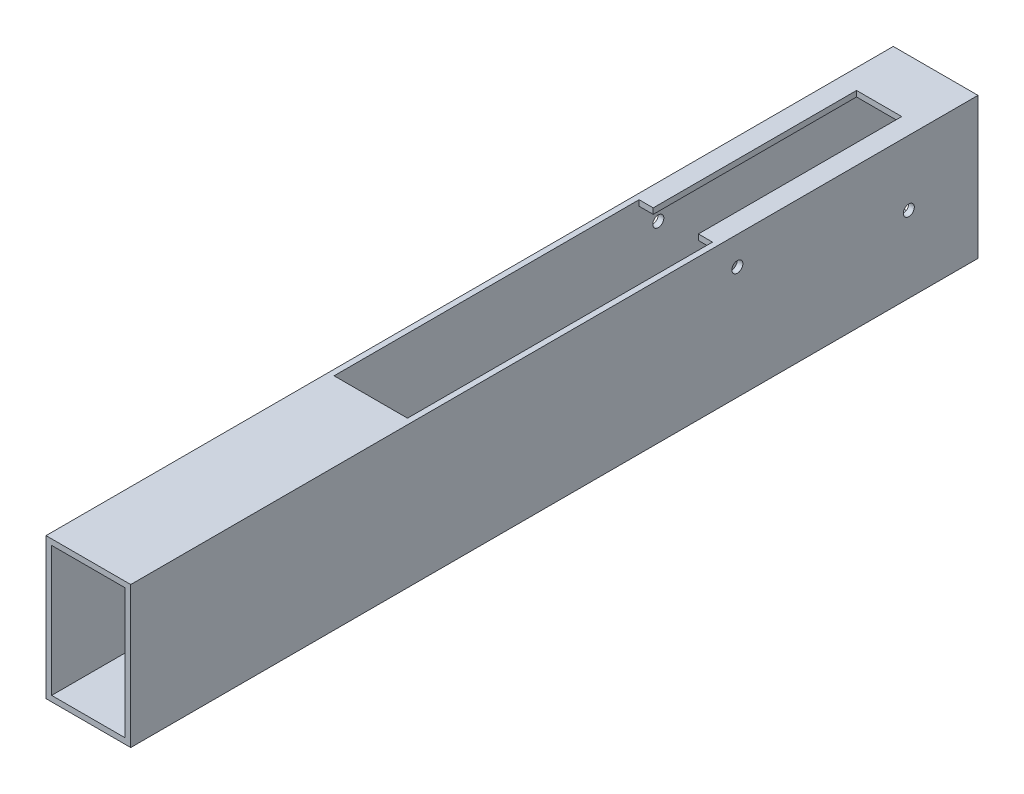
ISO-10303-21;
HEADER;
FILE_DESCRIPTION(('STEP AP214'),'2;1');
FILE_NAME('part.step','',(''),(''),'','','');
FILE_SCHEMA(('AUTOMOTIVE_DESIGN { 1 0 10303 214 1 1 1 1 }'));
ENDSEC;
DATA;
#1=APPLICATION_CONTEXT('core data for automotive mechanical design processes');
#2=APPLICATION_PROTOCOL_DEFINITION('international standard','automotive_design',2000,#1);
#3=PRODUCT_CONTEXT('',#1,'mechanical');
#4=PRODUCT('Part','Part','',(#3));
#5=PRODUCT_RELATED_PRODUCT_CATEGORY('part','',(#4));
#6=PRODUCT_DEFINITION_FORMATION('','',#4);
#7=PRODUCT_DEFINITION_CONTEXT('part definition',#1,'design');
#8=PRODUCT_DEFINITION('design','',#6,#7);
#9=PRODUCT_DEFINITION_SHAPE('','',#8);
#10=(LENGTH_UNIT() NAMED_UNIT(*) SI_UNIT(.MILLI.,.METRE.));
#11=(NAMED_UNIT(*) PLANE_ANGLE_UNIT() SI_UNIT($,.RADIAN.));
#12=(NAMED_UNIT(*) SI_UNIT($,.STERADIAN.) SOLID_ANGLE_UNIT());
#13=UNCERTAINTY_MEASURE_WITH_UNIT(LENGTH_MEASURE(1.E-05),#10,'distance_accuracy_value','');
#14=(GEOMETRIC_REPRESENTATION_CONTEXT(3) GLOBAL_UNCERTAINTY_ASSIGNED_CONTEXT((#13)) GLOBAL_UNIT_ASSIGNED_CONTEXT((#10,
#11,#12)) REPRESENTATION_CONTEXT('',''));
#15=CARTESIAN_POINT('',(0.,0.,0.));
#16=DIRECTION('',(0.,0.,1.));
#17=DIRECTION('',(1.,0.,0.));
#18=AXIS2_PLACEMENT_3D('',#15,#16,#17);
#19=CARTESIAN_POINT('',(-15.,-25.,300.));
#20=DIRECTION('',(0.,1.,0.));
#21=DIRECTION('',(0.,0.,1.));
#22=AXIS2_PLACEMENT_3D('',#19,#20,#21);
#23=PLANE('',#22);
#24=DIRECTION('',(0.,0.,-1.));
#25=VECTOR('',#24,1.);
#26=CARTESIAN_POINT('',(-5.,-25.,89.1931635393647));
#27=LINE('',#26,#25);
#28=CARTESIAN_POINT('',(-5.,-25.,89.1931635393647));
#29=VERTEX_POINT('',#28);
#30=CARTESIAN_POINT('',(-5.,-25.,78.3075239045425));
#31=VERTEX_POINT('',#30);
#32=EDGE_CURVE('E564',#29,#31,#27,.T.);
#33=ORIENTED_EDGE('',*,*,#32,.F.);
#34=DIRECTION('',(1.,0.,0.));
#35=VECTOR('',#34,1.);
#36=CARTESIAN_POINT('',(-5.,-25.,89.1931635393647));
#37=LINE('',#36,#35);
#38=CARTESIAN_POINT('',(5.,-25.,89.1931635393647));
#39=VERTEX_POINT('',#38);
#40=EDGE_CURVE('E574',#29,#39,#37,.T.);
#41=ORIENTED_EDGE('',*,*,#40,.T.);
#42=DIRECTION('',(0.,0.,-1.));
#43=VECTOR('',#42,1.);
#44=CARTESIAN_POINT('',(5.,-25.,89.1931635393647));
#45=LINE('',#44,#43);
#46=CARTESIAN_POINT('',(5.,-25.,78.3075239045425));
#47=VERTEX_POINT('',#46);
#48=EDGE_CURVE('E577',#39,#47,#45,.T.);
#49=ORIENTED_EDGE('',*,*,#48,.T.);
#50=DIRECTION('',(1.,0.,0.));
#51=VECTOR('',#50,1.);
#52=CARTESIAN_POINT('',(-5.,-25.,78.3075239045425));
#53=LINE('',#52,#51);
#54=EDGE_CURVE('E590',#31,#47,#53,.T.);
#55=ORIENTED_EDGE('',*,*,#54,.F.);
#56=EDGE_LOOP('',(#33,#41,#49,#55));
#57=FACE_BOUND('',#56,.T.);
#58=DIRECTION('',(0.,0.,-1.));
#59=VECTOR('',#58,1.);
#60=CARTESIAN_POINT('',(-13.,-25.,200.));
#61=LINE('',#60,#59);
#62=CARTESIAN_POINT('',(-13.,-25.,200.));
#63=VERTEX_POINT('',#62);
#64=CARTESIAN_POINT('',(-13.,-25.,92.));
#65=VERTEX_POINT('',#64);
#66=EDGE_CURVE('E406',#63,#65,#61,.T.);
#67=ORIENTED_EDGE('',*,*,#66,.F.);
#68=DIRECTION('',(1.,0.,0.));
#69=VECTOR('',#68,1.);
#70=CARTESIAN_POINT('',(-13.,-25.,200.));
#71=LINE('',#70,#69);
#72=CARTESIAN_POINT('',(13.,-25.,200.));
#73=VERTEX_POINT('',#72);
#74=EDGE_CURVE('E418',#63,#73,#71,.T.);
#75=ORIENTED_EDGE('',*,*,#74,.T.);
#76=DIRECTION('',(0.,0.,-1.));
#77=VECTOR('',#76,1.);
#78=CARTESIAN_POINT('',(13.,-25.,200.));
#79=LINE('',#78,#77);
#80=CARTESIAN_POINT('',(13.,-25.,92.));
#81=VERTEX_POINT('',#80);
#82=EDGE_CURVE('E412',#73,#81,#79,.T.);
#83=ORIENTED_EDGE('',*,*,#82,.T.);
#84=DIRECTION('',(1.,0.,0.));
#85=VECTOR('',#84,1.);
#86=CARTESIAN_POINT('',(-13.,-25.,92.));
#87=LINE('',#86,#85);
#88=EDGE_CURVE('E415',#65,#81,#87,.T.);
#89=ORIENTED_EDGE('',*,*,#88,.F.);
#90=EDGE_LOOP('',(#67,#75,#83,#89));
#91=FACE_BOUND('',#90,.T.);
#92=DIRECTION('',(0.,0.,-1.));
#93=VECTOR('',#92,1.);
#94=CARTESIAN_POINT('',(-5.,-25.,65.4759650683432));
#95=LINE('',#94,#93);
#96=CARTESIAN_POINT('',(-5.,-25.,65.4759650683432));
#97=VERTEX_POINT('',#96);
#98=CARTESIAN_POINT('',(-5.,-25.,40.4759650683432));
#99=VERTEX_POINT('',#98);
#100=EDGE_CURVE('E597',#97,#99,#95,.T.);
#101=ORIENTED_EDGE('',*,*,#100,.F.);
#102=DIRECTION('',(1.,0.,0.));
#103=VECTOR('',#102,1.);
#104=CARTESIAN_POINT('',(-5.,-25.,65.4759650683432));
#105=LINE('',#104,#103);
#106=CARTESIAN_POINT('',(5.,-25.,65.4759650683432));
#107=VERTEX_POINT('',#106);
#108=EDGE_CURVE('E478',#97,#107,#105,.T.);
#109=ORIENTED_EDGE('',*,*,#108,.T.);
#110=DIRECTION('',(0.,0.,-1.));
#111=VECTOR('',#110,1.);
#112=CARTESIAN_POINT('',(5.,-25.,65.4759650683432));
#113=LINE('',#112,#111);
#114=CARTESIAN_POINT('',(5.,-25.,40.4759650683432));
#115=VERTEX_POINT('',#114);
#116=EDGE_CURVE('E609',#107,#115,#113,.T.);
#117=ORIENTED_EDGE('',*,*,#116,.T.);
#118=DIRECTION('',(1.,0.,0.));
#119=VECTOR('',#118,1.);
#120=CARTESIAN_POINT('',(-5.,-25.,40.4759650683432));
#121=LINE('',#120,#119);
#122=EDGE_CURVE('E617',#99,#115,#121,.T.);
#123=ORIENTED_EDGE('',*,*,#122,.F.);
#124=EDGE_LOOP('',(#101,#109,#117,#123));
#125=FACE_BOUND('',#124,.T.);
#126=DIRECTION('',(0.,0.,-1.));
#127=VECTOR('',#126,1.);
#128=CARTESIAN_POINT('',(-10.,-25.,0.));
#129=LINE('',#128,#127);
#130=CARTESIAN_POINT('',(-10.,-25.,25.));
#131=VERTEX_POINT('',#130);
#132=CARTESIAN_POINT('',(-10.,-25.,0.));
#133=VERTEX_POINT('',#132);
#134=EDGE_CURVE('E248',#131,#133,#129,.T.);
#135=ORIENTED_EDGE('',*,*,#134,.F.);
#136=DIRECTION('',(1.,0.,0.));
#137=VECTOR('',#136,1.);
#138=CARTESIAN_POINT('',(-10.,-25.,25.));
#139=LINE('',#138,#137);
#140=CARTESIAN_POINT('',(10.,-25.,25.));
#141=VERTEX_POINT('',#140);
#142=EDGE_CURVE('E552',#131,#141,#139,.T.);
#143=ORIENTED_EDGE('',*,*,#142,.T.);
#144=DIRECTION('',(0.,0.,-1.));
#145=VECTOR('',#144,1.);
#146=CARTESIAN_POINT('',(10.,-25.,0.));
#147=LINE('',#146,#145);
#148=CARTESIAN_POINT('',(10.,-25.,0.));
#149=VERTEX_POINT('',#148);
#150=EDGE_CURVE('E253',#141,#149,#147,.T.);
#151=ORIENTED_EDGE('',*,*,#150,.T.);
#152=DIRECTION('',(1.,0.,0.));
#153=VECTOR('',#152,1.);
#154=CARTESIAN_POINT('',(-15.,-25.,0.));
#155=LINE('',#154,#153);
#156=CARTESIAN_POINT('',(15.,-25.,0.));
#157=VERTEX_POINT('',#156);
#158=EDGE_CURVE('E311',#149,#157,#155,.T.);
#159=ORIENTED_EDGE('',*,*,#158,.T.);
#160=DIRECTION('',(0.,0.,-1.));
#161=VECTOR('',#160,1.);
#162=CARTESIAN_POINT('',(15.,-25.,300.));
#163=LINE('',#162,#161);
#164=CARTESIAN_POINT('',(15.,-25.,300.));
#165=VERTEX_POINT('',#164);
#166=EDGE_CURVE('E304',#165,#157,#163,.T.);
#167=ORIENTED_EDGE('',*,*,#166,.F.);
#168=DIRECTION('',(1.,0.,0.));
#169=VECTOR('',#168,1.);
#170=CARTESIAN_POINT('',(-15.,-25.,300.));
#171=LINE('',#170,#169);
#172=CARTESIAN_POINT('',(-15.,-25.,300.));
#173=VERTEX_POINT('',#172);
#174=EDGE_CURVE('E302',#173,#165,#171,.T.);
#175=ORIENTED_EDGE('',*,*,#174,.F.);
#176=DIRECTION('',(0.,0.,-1.));
#177=VECTOR('',#176,1.);
#178=CARTESIAN_POINT('',(-15.,-25.,300.));
#179=LINE('',#178,#177);
#180=CARTESIAN_POINT('',(-15.,-25.,0.));
#181=VERTEX_POINT('',#180);
#182=EDGE_CURVE('E315',#173,#181,#179,.T.);
#183=ORIENTED_EDGE('',*,*,#182,.T.);
#184=EDGE_CURVE('E298',#181,#133,#155,.T.);
#185=ORIENTED_EDGE('',*,*,#184,.T.);
#186=EDGE_LOOP('',(#135,#143,#151,#159,#167,#175,#183,#185));
#187=FACE_BOUND('',#186,.T.);
#188=ADVANCED_FACE('F32',(#57,#91,#125,#187),#23,.F.);
#189=CARTESIAN_POINT('',(-13.,-23.,300.));
#190=DIRECTION('',(0.,1.,0.));
#191=DIRECTION('',(-1.,0.,0.));
#192=AXIS2_PLACEMENT_3D('',#189,#190,#191);
#193=PLANE('',#192);
#194=DIRECTION('',(1.,0.,0.));
#195=VECTOR('',#194,1.);
#196=CARTESIAN_POINT('',(-5.,-23.,65.4759650683432));
#197=LINE('',#196,#195);
#198=CARTESIAN_POINT('',(-5.,-23.,65.4759650683432));
#199=VERTEX_POINT('',#198);
#200=CARTESIAN_POINT('',(5.,-23.,65.4759650683432));
#201=VERTEX_POINT('',#200);
#202=EDGE_CURVE('E399',#199,#201,#197,.T.);
#203=ORIENTED_EDGE('',*,*,#202,.F.);
#204=DIRECTION('',(0.,0.,1.));
#205=VECTOR('',#204,1.);
#206=CARTESIAN_POINT('',(-5.,-23.,65.4759650683432));
#207=LINE('',#206,#205);
#208=CARTESIAN_POINT('',(-5.,-23.,40.4759650683432));
#209=VERTEX_POINT('',#208);
#210=EDGE_CURVE('E604',#209,#199,#207,.T.);
#211=ORIENTED_EDGE('',*,*,#210,.F.);
#212=DIRECTION('',(1.,0.,0.));
#213=VECTOR('',#212,1.);
#214=CARTESIAN_POINT('',(-5.,-23.,40.4759650683432));
#215=LINE('',#214,#213);
#216=CARTESIAN_POINT('',(5.,-23.,40.4759650683432));
#217=VERTEX_POINT('',#216);
#218=EDGE_CURVE('E402',#209,#217,#215,.T.);
#219=ORIENTED_EDGE('',*,*,#218,.T.);
#220=DIRECTION('',(0.,0.,1.));
#221=VECTOR('',#220,1.);
#222=CARTESIAN_POINT('',(5.,-23.,65.4759650683432));
#223=LINE('',#222,#221);
#224=EDGE_CURVE('E598',#217,#201,#223,.T.);
#225=ORIENTED_EDGE('',*,*,#224,.T.);
#226=EDGE_LOOP('',(#203,#211,#219,#225));
#227=FACE_BOUND('',#226,.T.);
#228=DIRECTION('',(1.,0.,0.));
#229=VECTOR('',#228,1.);
#230=CARTESIAN_POINT('',(-5.,-23.,89.1931635393647));
#231=LINE('',#230,#229);
#232=CARTESIAN_POINT('',(-5.,-23.,89.1931635393647));
#233=VERTEX_POINT('',#232);
#234=CARTESIAN_POINT('',(5.,-23.,89.1931635393647));
#235=VERTEX_POINT('',#234);
#236=EDGE_CURVE('E583',#233,#235,#231,.T.);
#237=ORIENTED_EDGE('',*,*,#236,.F.);
#238=DIRECTION('',(0.,0.,1.));
#239=VECTOR('',#238,1.);
#240=CARTESIAN_POINT('',(-5.,-23.,89.1931635393647));
#241=LINE('',#240,#239);
#242=CARTESIAN_POINT('',(-5.,-23.,78.3075239045425));
#243=VERTEX_POINT('',#242);
#244=EDGE_CURVE('E571',#243,#233,#241,.T.);
#245=ORIENTED_EDGE('',*,*,#244,.F.);
#246=DIRECTION('',(1.,0.,0.));
#247=VECTOR('',#246,1.);
#248=CARTESIAN_POINT('',(-5.,-23.,78.3075239045425));
#249=LINE('',#248,#247);
#250=CARTESIAN_POINT('',(5.,-23.,78.3075239045425));
#251=VERTEX_POINT('',#250);
#252=EDGE_CURVE('E587',#243,#251,#249,.T.);
#253=ORIENTED_EDGE('',*,*,#252,.T.);
#254=DIRECTION('',(0.,0.,1.));
#255=VECTOR('',#254,1.);
#256=CARTESIAN_POINT('',(5.,-23.,89.1931635393647));
#257=LINE('',#256,#255);
#258=EDGE_CURVE('E565',#251,#235,#257,.T.);
#259=ORIENTED_EDGE('',*,*,#258,.T.);
#260=EDGE_LOOP('',(#237,#245,#253,#259));
#261=FACE_BOUND('',#260,.T.);
#262=DIRECTION('',(1.,0.,0.));
#263=VECTOR('',#262,1.);
#264=CARTESIAN_POINT('',(-10.,-23.,25.));
#265=LINE('',#264,#263);
#266=CARTESIAN_POINT('',(-10.,-23.,25.));
#267=VERTEX_POINT('',#266);
#268=CARTESIAN_POINT('',(10.,-23.,25.));
#269=VERTEX_POINT('',#268);
#270=EDGE_CURVE('E261',#267,#269,#265,.T.);
#271=ORIENTED_EDGE('',*,*,#270,.F.);
#272=DIRECTION('',(0.,0.,1.));
#273=VECTOR('',#272,1.);
#274=CARTESIAN_POINT('',(-10.,-23.,0.));
#275=LINE('',#274,#273);
#276=CARTESIAN_POINT('',(-10.,-23.,0.));
#277=VERTEX_POINT('',#276);
#278=EDGE_CURVE('E245',#277,#267,#275,.T.);
#279=ORIENTED_EDGE('',*,*,#278,.F.);
#280=DIRECTION('',(1.,0.,0.));
#281=VECTOR('',#280,1.);
#282=CARTESIAN_POINT('',(-13.,-23.,0.));
#283=LINE('',#282,#281);
#284=CARTESIAN_POINT('',(-13.,-23.,0.));
#285=VERTEX_POINT('',#284);
#286=EDGE_CURVE('E259',#285,#277,#283,.T.);
#287=ORIENTED_EDGE('',*,*,#286,.F.);
#288=DIRECTION('',(0.,0.,-1.));
#289=VECTOR('',#288,1.);
#290=CARTESIAN_POINT('',(-13.,-23.,300.));
#291=LINE('',#290,#289);
#292=CARTESIAN_POINT('',(-13.,-23.,92.));
#293=VERTEX_POINT('',#292);
#294=EDGE_CURVE('E285',#293,#285,#291,.T.);
#295=ORIENTED_EDGE('',*,*,#294,.F.);
#296=DIRECTION('',(-1.,0.,0.));
#297=VECTOR('',#296,1.);
#298=CARTESIAN_POINT('',(-13.,-23.,92.));
#299=LINE('',#298,#297);
#300=CARTESIAN_POINT('',(13.,-23.,92.));
#301=VERTEX_POINT('',#300);
#302=EDGE_CURVE('E378',#301,#293,#299,.T.);
#303=ORIENTED_EDGE('',*,*,#302,.F.);
#304=DIRECTION('',(0.,0.,-1.));
#305=VECTOR('',#304,1.);
#306=CARTESIAN_POINT('',(13.,-23.,300.));
#307=LINE('',#306,#305);
#308=CARTESIAN_POINT('',(13.,-23.,0.));
#309=VERTEX_POINT('',#308);
#310=EDGE_CURVE('E280',#301,#309,#307,.T.);
#311=ORIENTED_EDGE('',*,*,#310,.T.);
#312=CARTESIAN_POINT('',(9.99999999999999,-23.,0.));
#313=VERTEX_POINT('',#312);
#314=EDGE_CURVE('E269',#313,#309,#283,.T.);
#315=ORIENTED_EDGE('',*,*,#314,.F.);
#316=DIRECTION('',(0.,0.,1.));
#317=VECTOR('',#316,1.);
#318=CARTESIAN_POINT('',(10.,-23.,0.));
#319=LINE('',#318,#317);
#320=EDGE_CURVE('E47',#313,#269,#319,.T.);
#321=ORIENTED_EDGE('',*,*,#320,.T.);
#322=EDGE_LOOP('',(#271,#279,#287,#295,#303,#311,#315,#321));
#323=FACE_BOUND('',#322,.T.);
#324=ADVANCED_FACE('F257',(#227,#261,#323),#193,.T.);
#325=CARTESIAN_POINT('',(0.,0.,0.));
#326=DIRECTION('',(0.,0.,1.));
#327=DIRECTION('',(1.,0.,0.));
#328=AXIS2_PLACEMENT_3D('',#325,#326,#327);
#329=PLANE('',#328);
#330=DIRECTION('',(0.,1.,0.));
#331=VECTOR('',#330,1.);
#332=CARTESIAN_POINT('',(-10.,-25.,0.));
#333=LINE('',#332,#331);
#334=EDGE_CURVE('E241',#133,#277,#333,.T.);
#335=ORIENTED_EDGE('',*,*,#334,.F.);
#336=ORIENTED_EDGE('',*,*,#184,.F.);
#337=DIRECTION('',(0.,-1.,0.));
#338=VECTOR('',#337,1.);
#339=CARTESIAN_POINT('',(-15.,25.,0.));
#340=LINE('',#339,#338);
#341=CARTESIAN_POINT('',(-15.,25.,0.));
#342=VERTEX_POINT('',#341);
#343=EDGE_CURVE('E309',#342,#181,#340,.T.);
#344=ORIENTED_EDGE('',*,*,#343,.F.);
#345=DIRECTION('',(-1.,0.,0.));
#346=VECTOR('',#345,1.);
#347=CARTESIAN_POINT('',(-15.,25.,0.));
#348=LINE('',#347,#346);
#349=CARTESIAN_POINT('',(15.,25.,0.));
#350=VERTEX_POINT('',#349);
#351=EDGE_CURVE('E307',#350,#342,#348,.T.);
#352=ORIENTED_EDGE('',*,*,#351,.F.);
#353=DIRECTION('',(0.,1.,0.));
#354=VECTOR('',#353,1.);
#355=CARTESIAN_POINT('',(15.,25.,0.));
#356=LINE('',#355,#354);
#357=EDGE_CURVE('E293',#157,#350,#356,.T.);
#358=ORIENTED_EDGE('',*,*,#357,.F.);
#359=ORIENTED_EDGE('',*,*,#158,.F.);
#360=DIRECTION('',(0.,1.,0.));
#361=VECTOR('',#360,1.);
#362=CARTESIAN_POINT('',(10.,-25.,0.));
#363=LINE('',#362,#361);
#364=EDGE_CURVE('E909',#149,#313,#363,.T.);
#365=ORIENTED_EDGE('',*,*,#364,.T.);
#366=ORIENTED_EDGE('',*,*,#314,.T.);
#367=DIRECTION('',(0.,1.,0.));
#368=VECTOR('',#367,1.);
#369=CARTESIAN_POINT('',(13.,23.,0.));
#370=LINE('',#369,#368);
#371=CARTESIAN_POINT('',(13.,23.,0.));
#372=VERTEX_POINT('',#371);
#373=EDGE_CURVE('E268',#309,#372,#370,.T.);
#374=ORIENTED_EDGE('',*,*,#373,.T.);
#375=DIRECTION('',(-1.,0.,0.));
#376=VECTOR('',#375,1.);
#377=CARTESIAN_POINT('',(-13.,23.,0.));
#378=LINE('',#377,#376);
#379=CARTESIAN_POINT('',(-13.,23.,0.));
#380=VERTEX_POINT('',#379);
#381=EDGE_CURVE('E352',#372,#380,#378,.T.);
#382=ORIENTED_EDGE('',*,*,#381,.T.);
#383=DIRECTION('',(0.,-1.,0.));
#384=VECTOR('',#383,1.);
#385=CARTESIAN_POINT('',(-13.,23.,0.));
#386=LINE('',#385,#384);
#387=EDGE_CURVE('E267',#380,#285,#386,.T.);
#388=ORIENTED_EDGE('',*,*,#387,.T.);
#389=ORIENTED_EDGE('',*,*,#286,.T.);
#390=EDGE_LOOP('',(#335,#336,#344,#352,#358,#359,#365,#366,#374,#382,#388,#389));
#391=FACE_BOUND('',#390,.T.);
#392=ADVANCED_FACE('F264',(#391),#329,.F.);
#393=CARTESIAN_POINT('',(-13.,23.,300.));
#394=DIRECTION('',(0.,-1.,0.));
#395=DIRECTION('',(0.,0.,-1.));
#396=AXIS2_PLACEMENT_3D('',#393,#394,#395);
#397=PLANE('',#396);
#398=DIRECTION('',(-1.,0.,0.));
#399=VECTOR('',#398,1.);
#400=CARTESIAN_POINT('',(-13.,23.,200.));
#401=LINE('',#400,#399);
#402=CARTESIAN_POINT('',(13.,23.,200.));
#403=VERTEX_POINT('',#402);
#404=CARTESIAN_POINT('',(-13.,23.,200.));
#405=VERTEX_POINT('',#404);
#406=EDGE_CURVE('E433',#403,#405,#401,.T.);
#407=ORIENTED_EDGE('',*,*,#406,.F.);
#408=DIRECTION('',(0.,0.,-1.));
#409=VECTOR('',#408,1.);
#410=CARTESIAN_POINT('',(13.,23.,300.));
#411=LINE('',#410,#409);
#412=CARTESIAN_POINT('',(13.,23.,300.));
#413=VERTEX_POINT('',#412);
#414=EDGE_CURVE('E277',#413,#403,#411,.T.);
#415=ORIENTED_EDGE('',*,*,#414,.F.);
#416=DIRECTION('',(-1.,0.,0.));
#417=VECTOR('',#416,1.);
#418=CARTESIAN_POINT('',(-13.,23.,300.));
#419=LINE('',#418,#417);
#420=CARTESIAN_POINT('',(-13.,23.,300.));
#421=VERTEX_POINT('',#420);
#422=EDGE_CURVE('E272',#413,#421,#419,.T.);
#423=ORIENTED_EDGE('',*,*,#422,.T.);
#424=DIRECTION('',(0.,0.,-1.));
#425=VECTOR('',#424,1.);
#426=CARTESIAN_POINT('',(-13.,23.,300.));
#427=LINE('',#426,#425);
#428=EDGE_CURVE('E290',#421,#405,#427,.T.);
#429=ORIENTED_EDGE('',*,*,#428,.T.);
#430=EDGE_LOOP('',(#407,#415,#423,#429));
#431=FACE_BOUND('',#430,.T.);
#432=ADVANCED_FACE('F701',(#431),#397,.T.);
#433=DIRECTION('',(1.,0.,0.));
#434=VECTOR('',#433,1.);
#435=CARTESIAN_POINT('',(-13.,-23.,200.));
#436=LINE('',#435,#434);
#437=CARTESIAN_POINT('',(-13.,-23.,200.));
#438=VERTEX_POINT('',#437);
#439=CARTESIAN_POINT('',(13.,-23.,200.));
#440=VERTEX_POINT('',#439);
#441=EDGE_CURVE('E382',#438,#440,#436,.T.);
#442=ORIENTED_EDGE('',*,*,#441,.F.);
#443=CARTESIAN_POINT('',(-13.,-23.,300.));
#444=VERTEX_POINT('',#443);
#445=EDGE_CURVE('E286',#444,#438,#291,.T.);
#446=ORIENTED_EDGE('',*,*,#445,.F.);
#447=DIRECTION('',(1.,0.,0.));
#448=VECTOR('',#447,1.);
#449=CARTESIAN_POINT('',(-13.,-23.,300.));
#450=LINE('',#449,#448);
#451=CARTESIAN_POINT('',(13.,-23.,300.));
#452=VERTEX_POINT('',#451);
#453=EDGE_CURVE('E356',#444,#452,#450,.T.);
#454=ORIENTED_EDGE('',*,*,#453,.T.);
#455=EDGE_CURVE('E282',#452,#440,#307,.T.);
#456=ORIENTED_EDGE('',*,*,#455,.T.);
#457=EDGE_LOOP('',(#442,#446,#454,#456));
#458=FACE_BOUND('',#457,.T.);
#459=ADVANCED_FACE('F516',(#458),#193,.T.);
#460=CARTESIAN_POINT('',(0.,0.,300.));
#461=DIRECTION('',(0.,0.,1.));
#462=DIRECTION('',(1.,0.,0.));
#463=AXIS2_PLACEMENT_3D('',#460,#461,#462);
#464=PLANE('',#463);
#465=DIRECTION('',(0.,1.,0.));
#466=VECTOR('',#465,1.);
#467=CARTESIAN_POINT('',(15.,25.,300.));
#468=LINE('',#467,#466);
#469=CARTESIAN_POINT('',(15.,25.,300.));
#470=VERTEX_POINT('',#469);
#471=EDGE_CURVE('E294',#165,#470,#468,.T.);
#472=ORIENTED_EDGE('',*,*,#471,.T.);
#473=DIRECTION('',(-1.,0.,0.));
#474=VECTOR('',#473,1.);
#475=CARTESIAN_POINT('',(-15.,25.,300.));
#476=LINE('',#475,#474);
#477=CARTESIAN_POINT('',(-15.,25.,300.));
#478=VERTEX_POINT('',#477);
#479=EDGE_CURVE('E297',#470,#478,#476,.T.);
#480=ORIENTED_EDGE('',*,*,#479,.T.);
#481=DIRECTION('',(0.,-1.,0.));
#482=VECTOR('',#481,1.);
#483=CARTESIAN_POINT('',(-15.,25.,300.));
#484=LINE('',#483,#482);
#485=EDGE_CURVE('E300',#478,#173,#484,.T.);
#486=ORIENTED_EDGE('',*,*,#485,.T.);
#487=ORIENTED_EDGE('',*,*,#174,.T.);
#488=EDGE_LOOP('',(#472,#480,#486,#487));
#489=FACE_BOUND('',#488,.T.);
#490=DIRECTION('',(0.,-1.,0.));
#491=VECTOR('',#490,1.);
#492=CARTESIAN_POINT('',(-13.,23.,300.));
#493=LINE('',#492,#491);
#494=EDGE_CURVE('E354',#421,#444,#493,.T.);
#495=ORIENTED_EDGE('',*,*,#494,.F.);
#496=ORIENTED_EDGE('',*,*,#422,.F.);
#497=DIRECTION('',(0.,1.,0.));
#498=VECTOR('',#497,1.);
#499=CARTESIAN_POINT('',(13.,23.,300.));
#500=LINE('',#499,#498);
#501=EDGE_CURVE('E359',#452,#413,#500,.T.);
#502=ORIENTED_EDGE('',*,*,#501,.F.);
#503=ORIENTED_EDGE('',*,*,#453,.F.);
#504=EDGE_LOOP('',(#495,#496,#502,#503));
#505=FACE_BOUND('',#504,.T.);
#506=ADVANCED_FACE('F527',(#489,#505),#464,.T.);
#507=CARTESIAN_POINT('',(15.,25.,300.));
#508=DIRECTION('',(-1.,0.,0.));
#509=DIRECTION('',(0.,-1.,0.));
#510=AXIS2_PLACEMENT_3D('',#507,#508,#509);
#511=PLANE('',#510);
#512=CARTESIAN_POINT('',(15.,2.,24.5));
#513=DIRECTION('',(1.,0.,0.));
#514=DIRECTION('',(0.,0.,-1.));
#515=AXIS2_PLACEMENT_3D('',#512,#513,#514);
#516=CIRCLE('',#515,1.95);
#517=CARTESIAN_POINT('',(15.,2.,22.55));
#518=VERTEX_POINT('',#517);
#519=EDGE_CURVE('E337',#518,#518,#516,.T.);
#520=ORIENTED_EDGE('',*,*,#519,.F.);
#521=EDGE_LOOP('',(#520));
#522=FACE_BOUND('',#521,.T.);
#523=CARTESIAN_POINT('',(15.,15.,85.2));
#524=DIRECTION('',(1.,0.,0.));
#525=DIRECTION('',(0.,0.,-1.));
#526=AXIS2_PLACEMENT_3D('',#523,#524,#525);
#527=CIRCLE('',#526,1.95);
#528=CARTESIAN_POINT('',(15.,15.,83.25));
#529=VERTEX_POINT('',#528);
#530=EDGE_CURVE('E334',#529,#529,#527,.T.);
#531=ORIENTED_EDGE('',*,*,#530,.F.);
#532=EDGE_LOOP('',(#531));
#533=FACE_BOUND('',#532,.T.);
#534=ORIENTED_EDGE('',*,*,#357,.T.);
#535=DIRECTION('',(0.,0.,-1.));
#536=VECTOR('',#535,1.);
#537=CARTESIAN_POINT('',(15.,25.,300.));
#538=LINE('',#537,#536);
#539=EDGE_CURVE('E40',#470,#350,#538,.T.);
#540=ORIENTED_EDGE('',*,*,#539,.F.);
#541=ORIENTED_EDGE('',*,*,#471,.F.);
#542=ORIENTED_EDGE('',*,*,#166,.T.);
#543=EDGE_LOOP('',(#534,#540,#541,#542));
#544=FACE_BOUND('',#543,.T.);
#545=ADVANCED_FACE('F34',(#522,#533,#544),#511,.F.);
#546=CARTESIAN_POINT('',(-15.,25.,300.));
#547=DIRECTION('',(0.,-1.,0.));
#548=DIRECTION('',(0.,0.,-1.));
#549=AXIS2_PLACEMENT_3D('',#546,#547,#548);
#550=PLANE('',#549);
#551=DIRECTION('',(0.,0.,1.));
#552=VECTOR('',#551,1.);
#553=CARTESIAN_POINT('',(-13.,25.,92.));
#554=LINE('',#553,#552);
#555=CARTESIAN_POINT('',(-13.,25.,92.));
#556=VERTEX_POINT('',#555);
#557=CARTESIAN_POINT('',(-13.,25.,200.));
#558=VERTEX_POINT('',#557);
#559=EDGE_CURVE('E475',#556,#558,#554,.T.);
#560=ORIENTED_EDGE('',*,*,#559,.F.);
#561=DIRECTION('',(1.,0.,0.));
#562=VECTOR('',#561,1.);
#563=CARTESIAN_POINT('',(-13.,25.,92.));
#564=LINE('',#563,#562);
#565=CARTESIAN_POINT('',(-8.,25.,92.));
#566=VERTEX_POINT('',#565);
#567=EDGE_CURVE('E423',#556,#566,#564,.T.);
#568=ORIENTED_EDGE('',*,*,#567,.T.);
#569=DIRECTION('',(0.,0.,1.));
#570=VECTOR('',#569,1.);
#571=CARTESIAN_POINT('',(-8.,25.,97.25));
#572=LINE('',#571,#570);
#573=CARTESIAN_POINT('',(-8.,25.,20.));
#574=VERTEX_POINT('',#573);
#575=EDGE_CURVE('E436',#574,#566,#572,.T.);
#576=ORIENTED_EDGE('',*,*,#575,.F.);
#577=DIRECTION('',(1.,0.,0.));
#578=VECTOR('',#577,1.);
#579=CARTESIAN_POINT('',(-8.,25.,20.));
#580=LINE('',#579,#578);
#581=CARTESIAN_POINT('',(8.,25.,20.));
#582=VERTEX_POINT('',#581);
#583=EDGE_CURVE('E442',#574,#582,#580,.T.);
#584=ORIENTED_EDGE('',*,*,#583,.T.);
#585=DIRECTION('',(0.,0.,1.));
#586=VECTOR('',#585,1.);
#587=CARTESIAN_POINT('',(8.,25.,97.25));
#588=LINE('',#587,#586);
#589=CARTESIAN_POINT('',(8.,25.,92.));
#590=VERTEX_POINT('',#589);
#591=EDGE_CURVE('E435',#582,#590,#588,.T.);
#592=ORIENTED_EDGE('',*,*,#591,.T.);
#593=CARTESIAN_POINT('',(13.,25.,92.));
#594=VERTEX_POINT('',#593);
#595=EDGE_CURVE('E426',#590,#594,#564,.T.);
#596=ORIENTED_EDGE('',*,*,#595,.T.);
#597=DIRECTION('',(0.,0.,1.));
#598=VECTOR('',#597,1.);
#599=CARTESIAN_POINT('',(13.,25.,92.));
#600=LINE('',#599,#598);
#601=CARTESIAN_POINT('',(13.,25.,200.));
#602=VERTEX_POINT('',#601);
#603=EDGE_CURVE('E396',#594,#602,#600,.T.);
#604=ORIENTED_EDGE('',*,*,#603,.T.);
#605=DIRECTION('',(1.,0.,0.));
#606=VECTOR('',#605,1.);
#607=CARTESIAN_POINT('',(-13.,25.,200.));
#608=LINE('',#607,#606);
#609=EDGE_CURVE('E421',#558,#602,#608,.T.);
#610=ORIENTED_EDGE('',*,*,#609,.F.);
#611=EDGE_LOOP('',(#560,#568,#576,#584,#592,#596,#604,#610));
#612=FACE_BOUND('',#611,.T.);
#613=ORIENTED_EDGE('',*,*,#351,.T.);
#614=DIRECTION('',(0.,0.,-1.));
#615=VECTOR('',#614,1.);
#616=CARTESIAN_POINT('',(-15.,25.,300.));
#617=LINE('',#616,#615);
#618=EDGE_CURVE('E318',#478,#342,#617,.T.);
#619=ORIENTED_EDGE('',*,*,#618,.F.);
#620=ORIENTED_EDGE('',*,*,#479,.F.);
#621=ORIENTED_EDGE('',*,*,#539,.T.);
#622=EDGE_LOOP('',(#613,#619,#620,#621));
#623=FACE_BOUND('',#622,.T.);
#624=ADVANCED_FACE('F466',(#612,#623),#550,.F.);
#625=CARTESIAN_POINT('',(-15.,25.,300.));
#626=DIRECTION('',(1.,0.,0.));
#627=DIRECTION('',(0.,1.,0.));
#628=AXIS2_PLACEMENT_3D('',#625,#626,#627);
#629=PLANE('',#628);
#630=CARTESIAN_POINT('',(-15.,2.,24.5));
#631=DIRECTION('',(1.,0.,0.));
#632=DIRECTION('',(0.,0.,-1.));
#633=AXIS2_PLACEMENT_3D('',#630,#631,#632);
#634=CIRCLE('',#633,1.95);
#635=CARTESIAN_POINT('',(-15.,2.,22.55));
#636=VERTEX_POINT('',#635);
#637=EDGE_CURVE('E330',#636,#636,#634,.T.);
#638=ORIENTED_EDGE('',*,*,#637,.T.);
#639=EDGE_LOOP('',(#638));
#640=FACE_BOUND('',#639,.T.);
#641=CARTESIAN_POINT('',(-15.,15.,85.2));
#642=DIRECTION('',(1.,0.,0.));
#643=DIRECTION('',(0.,0.,-1.));
#644=AXIS2_PLACEMENT_3D('',#641,#642,#643);
#645=CIRCLE('',#644,1.95);
#646=CARTESIAN_POINT('',(-15.,15.,83.25));
#647=VERTEX_POINT('',#646);
#648=EDGE_CURVE('E326',#647,#647,#645,.T.);
#649=ORIENTED_EDGE('',*,*,#648,.T.);
#650=EDGE_LOOP('',(#649));
#651=FACE_BOUND('',#650,.T.);
#652=ORIENTED_EDGE('',*,*,#343,.T.);
#653=ORIENTED_EDGE('',*,*,#182,.F.);
#654=ORIENTED_EDGE('',*,*,#485,.F.);
#655=ORIENTED_EDGE('',*,*,#618,.T.);
#656=EDGE_LOOP('',(#652,#653,#654,#655));
#657=FACE_BOUND('',#656,.T.);
#658=ADVANCED_FACE('F521',(#640,#651,#657),#629,.F.);
#659=DIRECTION('',(1.,0.,0.));
#660=VECTOR('',#659,1.);
#661=CARTESIAN_POINT('',(-13.,23.,92.));
#662=LINE('',#661,#660);
#663=CARTESIAN_POINT('',(-13.,23.,92.));
#664=VERTEX_POINT('',#663);
#665=CARTESIAN_POINT('',(-8.,23.,92.));
#666=VERTEX_POINT('',#665);
#667=EDGE_CURVE('E369',#664,#666,#662,.T.);
#668=ORIENTED_EDGE('',*,*,#667,.F.);
#669=EDGE_CURVE('E289',#664,#380,#427,.T.);
#670=ORIENTED_EDGE('',*,*,#669,.T.);
#671=ORIENTED_EDGE('',*,*,#381,.F.);
#672=CARTESIAN_POINT('',(13.,23.,92.));
#673=VERTEX_POINT('',#672);
#674=EDGE_CURVE('E281',#673,#372,#411,.T.);
#675=ORIENTED_EDGE('',*,*,#674,.F.);
#676=CARTESIAN_POINT('',(8.,23.,92.));
#677=VERTEX_POINT('',#676);
#678=EDGE_CURVE('E417',#677,#673,#662,.T.);
#679=ORIENTED_EDGE('',*,*,#678,.F.);
#680=DIRECTION('',(0.,0.,-1.));
#681=VECTOR('',#680,1.);
#682=CARTESIAN_POINT('',(8.,23.,300.));
#683=LINE('',#682,#681);
#684=CARTESIAN_POINT('',(8.,23.,20.));
#685=VERTEX_POINT('',#684);
#686=EDGE_CURVE('E448',#677,#685,#683,.T.);
#687=ORIENTED_EDGE('',*,*,#686,.T.);
#688=DIRECTION('',(1.,0.,0.));
#689=VECTOR('',#688,1.);
#690=CARTESIAN_POINT('',(-13.,23.,20.));
#691=LINE('',#690,#689);
#692=CARTESIAN_POINT('',(-8.,23.,20.));
#693=VERTEX_POINT('',#692);
#694=EDGE_CURVE('E342',#693,#685,#691,.T.);
#695=ORIENTED_EDGE('',*,*,#694,.F.);
#696=DIRECTION('',(0.,0.,-1.));
#697=VECTOR('',#696,1.);
#698=CARTESIAN_POINT('',(-8.,23.,300.));
#699=LINE('',#698,#697);
#700=EDGE_CURVE('E450',#666,#693,#699,.T.);
#701=ORIENTED_EDGE('',*,*,#700,.F.);
#702=EDGE_LOOP('',(#668,#670,#671,#675,#679,#687,#695,#701));
#703=FACE_BOUND('',#702,.T.);
#704=ADVANCED_FACE('F365',(#703),#397,.T.);
#705=CARTESIAN_POINT('',(-13.,23.,300.));
#706=DIRECTION('',(1.,0.,0.));
#707=DIRECTION('',(0.,1.,0.));
#708=AXIS2_PLACEMENT_3D('',#705,#706,#707);
#709=PLANE('',#708);
#710=ORIENTED_EDGE('',*,*,#669,.F.);
#711=DIRECTION('',(0.,1.,0.));
#712=VECTOR('',#711,1.);
#713=CARTESIAN_POINT('',(-13.,23.,92.));
#714=LINE('',#713,#712);
#715=EDGE_CURVE('E414',#664,#556,#714,.T.);
#716=ORIENTED_EDGE('',*,*,#715,.T.);
#717=ORIENTED_EDGE('',*,*,#559,.T.);
#718=DIRECTION('',(0.,-1.,0.));
#719=VECTOR('',#718,1.);
#720=CARTESIAN_POINT('',(-13.,25.,200.));
#721=LINE('',#720,#719);
#722=EDGE_CURVE('E481',#558,#405,#721,.T.);
#723=ORIENTED_EDGE('',*,*,#722,.T.);
#724=ORIENTED_EDGE('',*,*,#428,.F.);
#725=ORIENTED_EDGE('',*,*,#494,.T.);
#726=ORIENTED_EDGE('',*,*,#445,.T.);
#727=EDGE_CURVE('E480',#438,#63,#721,.T.);
#728=ORIENTED_EDGE('',*,*,#727,.T.);
#729=ORIENTED_EDGE('',*,*,#66,.T.);
#730=EDGE_CURVE('E375',#65,#293,#714,.T.);
#731=ORIENTED_EDGE('',*,*,#730,.T.);
#732=ORIENTED_EDGE('',*,*,#294,.T.);
#733=ORIENTED_EDGE('',*,*,#387,.F.);
#734=EDGE_LOOP('',(#710,#716,#717,#723,#724,#725,#726,#728,#729,#731,#732,#733));
#735=FACE_BOUND('',#734,.T.);
#736=CARTESIAN_POINT('',(-13.,2.,24.5));
#737=DIRECTION('',(1.,0.,0.));
#738=DIRECTION('',(0.,1.,0.));
#739=AXIS2_PLACEMENT_3D('',#736,#737,#738);
#740=CIRCLE('',#739,1.95);
#741=CARTESIAN_POINT('',(-13.,3.95,24.5));
#742=VERTEX_POINT('',#741);
#743=EDGE_CURVE('E329',#742,#742,#740,.T.);
#744=ORIENTED_EDGE('',*,*,#743,.F.);
#745=EDGE_LOOP('',(#744));
#746=FACE_BOUND('',#745,.T.);
#747=CARTESIAN_POINT('',(-13.,15.,85.2));
#748=DIRECTION('',(1.,0.,0.));
#749=DIRECTION('',(0.,1.,0.));
#750=AXIS2_PLACEMENT_3D('',#747,#748,#749);
#751=CIRCLE('',#750,1.95);
#752=CARTESIAN_POINT('',(-13.,16.95,85.2));
#753=VERTEX_POINT('',#752);
#754=EDGE_CURVE('E325',#753,#753,#751,.T.);
#755=ORIENTED_EDGE('',*,*,#754,.F.);
#756=EDGE_LOOP('',(#755));
#757=FACE_BOUND('',#756,.T.);
#758=ADVANCED_FACE('F371',(#735,#746,#757),#709,.T.);
#759=CARTESIAN_POINT('',(13.,23.,300.));
#760=DIRECTION('',(-1.,0.,0.));
#761=DIRECTION('',(0.,-1.,0.));
#762=AXIS2_PLACEMENT_3D('',#759,#760,#761);
#763=PLANE('',#762);
#764=ORIENTED_EDGE('',*,*,#310,.F.);
#765=DIRECTION('',(0.,1.,0.));
#766=VECTOR('',#765,1.);
#767=CARTESIAN_POINT('',(13.,23.,92.));
#768=LINE('',#767,#766);
#769=EDGE_CURVE('E389',#81,#301,#768,.T.);
#770=ORIENTED_EDGE('',*,*,#769,.F.);
#771=ORIENTED_EDGE('',*,*,#82,.F.);
#772=DIRECTION('',(0.,-1.,0.));
#773=VECTOR('',#772,1.);
#774=CARTESIAN_POINT('',(13.,25.,200.));
#775=LINE('',#774,#773);
#776=EDGE_CURVE('E409',#440,#73,#775,.T.);
#777=ORIENTED_EDGE('',*,*,#776,.F.);
#778=ORIENTED_EDGE('',*,*,#455,.F.);
#779=ORIENTED_EDGE('',*,*,#501,.T.);
#780=ORIENTED_EDGE('',*,*,#414,.T.);
#781=EDGE_CURVE('E410',#602,#403,#775,.T.);
#782=ORIENTED_EDGE('',*,*,#781,.F.);
#783=ORIENTED_EDGE('',*,*,#603,.F.);
#784=EDGE_CURVE('E393',#673,#594,#768,.T.);
#785=ORIENTED_EDGE('',*,*,#784,.F.);
#786=ORIENTED_EDGE('',*,*,#674,.T.);
#787=ORIENTED_EDGE('',*,*,#373,.F.);
#788=EDGE_LOOP('',(#764,#770,#771,#777,#778,#779,#780,#782,#783,#785,#786,#787));
#789=FACE_BOUND('',#788,.T.);
#790=CARTESIAN_POINT('',(13.,2.,24.5));
#791=DIRECTION('',(-1.,0.,0.));
#792=DIRECTION('',(0.,-1.,0.));
#793=AXIS2_PLACEMENT_3D('',#790,#791,#792);
#794=CIRCLE('',#793,1.95);
#795=CARTESIAN_POINT('',(13.,0.0500000000000027,24.5));
#796=VERTEX_POINT('',#795);
#797=EDGE_CURVE('E327',#796,#796,#794,.T.);
#798=ORIENTED_EDGE('',*,*,#797,.F.);
#799=EDGE_LOOP('',(#798));
#800=FACE_BOUND('',#799,.T.);
#801=CARTESIAN_POINT('',(13.,15.,85.2));
#802=DIRECTION('',(-1.,0.,0.));
#803=DIRECTION('',(0.,-1.,0.));
#804=AXIS2_PLACEMENT_3D('',#801,#802,#803);
#805=CIRCLE('',#804,1.95);
#806=CARTESIAN_POINT('',(13.,13.05,85.2));
#807=VERTEX_POINT('',#806);
#808=EDGE_CURVE('E323',#807,#807,#805,.T.);
#809=ORIENTED_EDGE('',*,*,#808,.F.);
#810=EDGE_LOOP('',(#809));
#811=FACE_BOUND('',#810,.T.);
#812=ADVANCED_FACE('F386',(#789,#800,#811),#763,.T.);
#813=CARTESIAN_POINT('',(-15.,15.,85.2));
#814=DIRECTION('',(1.,0.,0.));
#815=DIRECTION('',(0.,0.,-1.));
#816=AXIS2_PLACEMENT_3D('',#813,#814,#815);
#817=CYLINDRICAL_SURFACE('',#816,1.95);
#818=ORIENTED_EDGE('',*,*,#808,.T.);
#819=EDGE_LOOP('',(#818));
#820=FACE_BOUND('',#819,.T.);
#821=ORIENTED_EDGE('',*,*,#530,.T.);
#822=EDGE_LOOP('',(#821));
#823=FACE_BOUND('',#822,.T.);
#824=ADVANCED_FACE('F795',(#820,#823),#817,.F.);
#825=ORIENTED_EDGE('',*,*,#754,.T.);
#826=EDGE_LOOP('',(#825));
#827=FACE_BOUND('',#826,.T.);
#828=ORIENTED_EDGE('',*,*,#648,.F.);
#829=EDGE_LOOP('',(#828));
#830=FACE_BOUND('',#829,.T.);
#831=ADVANCED_FACE('F861',(#827,#830),#817,.F.);
#832=CARTESIAN_POINT('',(-15.,2.,24.5));
#833=DIRECTION('',(1.,0.,0.));
#834=DIRECTION('',(0.,0.,-1.));
#835=AXIS2_PLACEMENT_3D('',#832,#833,#834);
#836=CYLINDRICAL_SURFACE('',#835,1.95);
#837=ORIENTED_EDGE('',*,*,#797,.T.);
#838=EDGE_LOOP('',(#837));
#839=FACE_BOUND('',#838,.T.);
#840=ORIENTED_EDGE('',*,*,#519,.T.);
#841=EDGE_LOOP('',(#840));
#842=FACE_BOUND('',#841,.T.);
#843=ADVANCED_FACE('F851',(#839,#842),#836,.F.);
#844=ORIENTED_EDGE('',*,*,#743,.T.);
#845=EDGE_LOOP('',(#844));
#846=FACE_BOUND('',#845,.T.);
#847=ORIENTED_EDGE('',*,*,#637,.F.);
#848=EDGE_LOOP('',(#847));
#849=FACE_BOUND('',#848,.T.);
#850=ADVANCED_FACE('F842',(#846,#849),#836,.F.);
#851=CARTESIAN_POINT('',(-8.,25.,20.));
#852=DIRECTION('',(0.,0.,-1.));
#853=DIRECTION('',(-1.,0.,0.));
#854=AXIS2_PLACEMENT_3D('',#851,#852,#853);
#855=PLANE('',#854);
#856=ORIENTED_EDGE('',*,*,#694,.T.);
#857=DIRECTION('',(0.,1.,0.));
#858=VECTOR('',#857,1.);
#859=CARTESIAN_POINT('',(8.,25.,20.));
#860=LINE('',#859,#858);
#861=EDGE_CURVE('E440',#685,#582,#860,.T.);
#862=ORIENTED_EDGE('',*,*,#861,.T.);
#863=ORIENTED_EDGE('',*,*,#583,.F.);
#864=DIRECTION('',(0.,1.,0.));
#865=VECTOR('',#864,1.);
#866=CARTESIAN_POINT('',(-8.,25.,20.));
#867=LINE('',#866,#865);
#868=EDGE_CURVE('E439',#693,#574,#867,.T.);
#869=ORIENTED_EDGE('',*,*,#868,.F.);
#870=EDGE_LOOP('',(#856,#862,#863,#869));
#871=FACE_BOUND('',#870,.T.);
#872=ADVANCED_FACE('F455',(#871),#855,.F.);
#873=CARTESIAN_POINT('',(-8.,0.,0.));
#874=DIRECTION('',(-1.,0.,0.));
#875=DIRECTION('',(0.,0.,1.));
#876=AXIS2_PLACEMENT_3D('',#873,#874,#875);
#877=PLANE('',#876);
#878=ORIENTED_EDGE('',*,*,#575,.T.);
#879=DIRECTION('',(0.,-1.,0.));
#880=VECTOR('',#879,1.);
#881=CARTESIAN_POINT('',(-8.,0.,92.));
#882=LINE('',#881,#880);
#883=EDGE_CURVE('E428',#566,#666,#882,.T.);
#884=ORIENTED_EDGE('',*,*,#883,.T.);
#885=ORIENTED_EDGE('',*,*,#700,.T.);
#886=ORIENTED_EDGE('',*,*,#868,.T.);
#887=EDGE_LOOP('',(#878,#884,#885,#886));
#888=FACE_BOUND('',#887,.T.);
#889=ADVANCED_FACE('F470',(#888),#877,.F.);
#890=CARTESIAN_POINT('',(8.,0.,0.));
#891=DIRECTION('',(-1.,0.,0.));
#892=DIRECTION('',(0.,0.,1.));
#893=AXIS2_PLACEMENT_3D('',#890,#891,#892);
#894=PLANE('',#893);
#895=DIRECTION('',(0.,-1.,0.));
#896=VECTOR('',#895,1.);
#897=CARTESIAN_POINT('',(8.,0.,92.));
#898=LINE('',#897,#896);
#899=EDGE_CURVE('E11',#590,#677,#898,.T.);
#900=ORIENTED_EDGE('',*,*,#899,.F.);
#901=ORIENTED_EDGE('',*,*,#591,.F.);
#902=ORIENTED_EDGE('',*,*,#861,.F.);
#903=ORIENTED_EDGE('',*,*,#686,.F.);
#904=EDGE_LOOP('',(#900,#901,#902,#903));
#905=FACE_BOUND('',#904,.T.);
#906=ADVANCED_FACE('F462',(#905),#894,.T.);
#907=CARTESIAN_POINT('',(-13.,23.,92.));
#908=DIRECTION('',(0.,0.,-1.));
#909=DIRECTION('',(-1.,0.,0.));
#910=AXIS2_PLACEMENT_3D('',#907,#908,#909);
#911=PLANE('',#910);
#912=ORIENTED_EDGE('',*,*,#667,.T.);
#913=ORIENTED_EDGE('',*,*,#883,.F.);
#914=ORIENTED_EDGE('',*,*,#567,.F.);
#915=ORIENTED_EDGE('',*,*,#715,.F.);
#916=EDGE_LOOP('',(#912,#913,#914,#915));
#917=FACE_BOUND('',#916,.T.);
#918=ADVANCED_FACE('F472',(#917),#911,.F.);
#919=ORIENTED_EDGE('',*,*,#678,.T.);
#920=ORIENTED_EDGE('',*,*,#784,.T.);
#921=ORIENTED_EDGE('',*,*,#595,.F.);
#922=ORIENTED_EDGE('',*,*,#899,.T.);
#923=EDGE_LOOP('',(#919,#920,#921,#922));
#924=FACE_BOUND('',#923,.T.);
#925=ADVANCED_FACE('F497',(#924),#911,.F.);
#926=CARTESIAN_POINT('',(-13.,25.,200.));
#927=DIRECTION('',(0.,0.,1.));
#928=DIRECTION('',(1.,0.,0.));
#929=AXIS2_PLACEMENT_3D('',#926,#927,#928);
#930=PLANE('',#929);
#931=ORIENTED_EDGE('',*,*,#406,.T.);
#932=ORIENTED_EDGE('',*,*,#722,.F.);
#933=ORIENTED_EDGE('',*,*,#609,.T.);
#934=ORIENTED_EDGE('',*,*,#781,.T.);
#935=EDGE_LOOP('',(#931,#932,#933,#934));
#936=FACE_BOUND('',#935,.T.);
#937=ADVANCED_FACE('F495',(#936),#930,.F.);
#938=ORIENTED_EDGE('',*,*,#302,.T.);
#939=ORIENTED_EDGE('',*,*,#730,.F.);
#940=ORIENTED_EDGE('',*,*,#88,.T.);
#941=ORIENTED_EDGE('',*,*,#769,.T.);
#942=EDGE_LOOP('',(#938,#939,#940,#941));
#943=FACE_BOUND('',#942,.T.);
#944=ADVANCED_FACE('F493',(#943),#911,.F.);
#945=ORIENTED_EDGE('',*,*,#441,.T.);
#946=ORIENTED_EDGE('',*,*,#776,.T.);
#947=ORIENTED_EDGE('',*,*,#74,.F.);
#948=ORIENTED_EDGE('',*,*,#727,.F.);
#949=EDGE_LOOP('',(#945,#946,#947,#948));
#950=FACE_BOUND('',#949,.T.);
#951=ADVANCED_FACE('F490',(#950),#930,.F.);
#952=CARTESIAN_POINT('',(-5.,-23.,65.4759650683432));
#953=DIRECTION('',(0.,0.,1.));
#954=DIRECTION('',(1.,0.,0.));
#955=AXIS2_PLACEMENT_3D('',#952,#953,#954);
#956=PLANE('',#955);
#957=DIRECTION('',(0.,-1.,0.));
#958=VECTOR('',#957,1.);
#959=CARTESIAN_POINT('',(5.,-23.,65.4759650683432));
#960=LINE('',#959,#958);
#961=EDGE_CURVE('E586',#201,#107,#960,.T.);
#962=ORIENTED_EDGE('',*,*,#961,.T.);
#963=ORIENTED_EDGE('',*,*,#108,.F.);
#964=DIRECTION('',(0.,-1.,0.));
#965=VECTOR('',#964,1.);
#966=CARTESIAN_POINT('',(-5.,-23.,65.4759650683432));
#967=LINE('',#966,#965);
#968=EDGE_CURVE('E594',#199,#97,#967,.T.);
#969=ORIENTED_EDGE('',*,*,#968,.F.);
#970=ORIENTED_EDGE('',*,*,#202,.T.);
#971=EDGE_LOOP('',(#962,#963,#969,#970));
#972=FACE_BOUND('',#971,.T.);
#973=ADVANCED_FACE('F502',(#972),#956,.F.);
#974=CARTESIAN_POINT('',(-5.,-23.,40.4759650683432));
#975=DIRECTION('',(0.,0.,-1.));
#976=DIRECTION('',(0.,1.,0.));
#977=AXIS2_PLACEMENT_3D('',#974,#975,#976);
#978=PLANE('',#977);
#979=DIRECTION('',(0.,1.,0.));
#980=VECTOR('',#979,1.);
#981=CARTESIAN_POINT('',(5.,-23.,40.4759650683432));
#982=LINE('',#981,#980);
#983=EDGE_CURVE('E612',#115,#217,#982,.T.);
#984=ORIENTED_EDGE('',*,*,#983,.T.);
#985=ORIENTED_EDGE('',*,*,#218,.F.);
#986=DIRECTION('',(0.,1.,0.));
#987=VECTOR('',#986,1.);
#988=CARTESIAN_POINT('',(-5.,-23.,40.4759650683432));
#989=LINE('',#988,#987);
#990=EDGE_CURVE('E601',#99,#209,#989,.T.);
#991=ORIENTED_EDGE('',*,*,#990,.F.);
#992=ORIENTED_EDGE('',*,*,#122,.T.);
#993=EDGE_LOOP('',(#984,#985,#991,#992));
#994=FACE_BOUND('',#993,.T.);
#995=ADVANCED_FACE('F632',(#994),#978,.F.);
#996=CARTESIAN_POINT('',(-5.,0.,0.));
#997=DIRECTION('',(1.,0.,0.));
#998=DIRECTION('',(0.,0.,-1.));
#999=AXIS2_PLACEMENT_3D('',#996,#997,#998);
#1000=PLANE('',#999);
#1001=ORIENTED_EDGE('',*,*,#968,.T.);
#1002=ORIENTED_EDGE('',*,*,#100,.T.);
#1003=ORIENTED_EDGE('',*,*,#990,.T.);
#1004=ORIENTED_EDGE('',*,*,#210,.T.);
#1005=EDGE_LOOP('',(#1001,#1002,#1003,#1004));
#1006=FACE_BOUND('',#1005,.T.);
#1007=ADVANCED_FACE('F625',(#1006),#1000,.T.);
#1008=CARTESIAN_POINT('',(5.,0.,0.));
#1009=DIRECTION('',(1.,0.,0.));
#1010=DIRECTION('',(0.,0.,-1.));
#1011=AXIS2_PLACEMENT_3D('',#1008,#1009,#1010);
#1012=PLANE('',#1011);
#1013=ORIENTED_EDGE('',*,*,#961,.F.);
#1014=ORIENTED_EDGE('',*,*,#224,.F.);
#1015=ORIENTED_EDGE('',*,*,#983,.F.);
#1016=ORIENTED_EDGE('',*,*,#116,.F.);
#1017=EDGE_LOOP('',(#1013,#1014,#1015,#1016));
#1018=FACE_BOUND('',#1017,.T.);
#1019=ADVANCED_FACE('F631',(#1018),#1012,.F.);
#1020=CARTESIAN_POINT('',(-5.,-23.,89.1931635393647));
#1021=DIRECTION('',(0.,0.,1.));
#1022=DIRECTION('',(1.,0.,0.));
#1023=AXIS2_PLACEMENT_3D('',#1020,#1021,#1022);
#1024=PLANE('',#1023);
#1025=DIRECTION('',(0.,-1.,0.));
#1026=VECTOR('',#1025,1.);
#1027=CARTESIAN_POINT('',(5.,-23.,89.1931635393647));
#1028=LINE('',#1027,#1026);
#1029=EDGE_CURVE('E559',#235,#39,#1028,.T.);
#1030=ORIENTED_EDGE('',*,*,#1029,.T.);
#1031=ORIENTED_EDGE('',*,*,#40,.F.);
#1032=DIRECTION('',(0.,-1.,0.));
#1033=VECTOR('',#1032,1.);
#1034=CARTESIAN_POINT('',(-5.,-23.,89.1931635393647));
#1035=LINE('',#1034,#1033);
#1036=EDGE_CURVE('E561',#233,#29,#1035,.T.);
#1037=ORIENTED_EDGE('',*,*,#1036,.F.);
#1038=ORIENTED_EDGE('',*,*,#236,.T.);
#1039=EDGE_LOOP('',(#1030,#1031,#1037,#1038));
#1040=FACE_BOUND('',#1039,.T.);
#1041=ADVANCED_FACE('F643',(#1040),#1024,.F.);
#1042=CARTESIAN_POINT('',(-5.,-23.,78.3075239045425));
#1043=DIRECTION('',(0.,0.,-1.));
#1044=DIRECTION('',(-1.,0.,0.));
#1045=AXIS2_PLACEMENT_3D('',#1042,#1043,#1044);
#1046=PLANE('',#1045);
#1047=DIRECTION('',(0.,1.,0.));
#1048=VECTOR('',#1047,1.);
#1049=CARTESIAN_POINT('',(5.,-23.,78.3075239045425));
#1050=LINE('',#1049,#1048);
#1051=EDGE_CURVE('E55',#47,#251,#1050,.T.);
#1052=ORIENTED_EDGE('',*,*,#1051,.T.);
#1053=ORIENTED_EDGE('',*,*,#252,.F.);
#1054=DIRECTION('',(0.,1.,0.));
#1055=VECTOR('',#1054,1.);
#1056=CARTESIAN_POINT('',(-5.,-23.,78.3075239045425));
#1057=LINE('',#1056,#1055);
#1058=EDGE_CURVE('E568',#31,#243,#1057,.T.);
#1059=ORIENTED_EDGE('',*,*,#1058,.F.);
#1060=ORIENTED_EDGE('',*,*,#54,.T.);
#1061=EDGE_LOOP('',(#1052,#1053,#1059,#1060));
#1062=FACE_BOUND('',#1061,.T.);
#1063=ADVANCED_FACE('F647',(#1062),#1046,.F.);
#1064=CARTESIAN_POINT('',(-5.,0.,0.));
#1065=DIRECTION('',(1.,0.,0.));
#1066=DIRECTION('',(0.,0.,-1.));
#1067=AXIS2_PLACEMENT_3D('',#1064,#1065,#1066);
#1068=PLANE('',#1067);
#1069=ORIENTED_EDGE('',*,*,#1036,.T.);
#1070=ORIENTED_EDGE('',*,*,#32,.T.);
#1071=ORIENTED_EDGE('',*,*,#1058,.T.);
#1072=ORIENTED_EDGE('',*,*,#244,.T.);
#1073=EDGE_LOOP('',(#1069,#1070,#1071,#1072));
#1074=FACE_BOUND('',#1073,.T.);
#1075=ADVANCED_FACE('F651',(#1074),#1068,.T.);
#1076=CARTESIAN_POINT('',(5.,0.,0.));
#1077=DIRECTION('',(1.,0.,0.));
#1078=DIRECTION('',(0.,0.,-1.));
#1079=AXIS2_PLACEMENT_3D('',#1076,#1077,#1078);
#1080=PLANE('',#1079);
#1081=ORIENTED_EDGE('',*,*,#1029,.F.);
#1082=ORIENTED_EDGE('',*,*,#258,.F.);
#1083=ORIENTED_EDGE('',*,*,#1051,.F.);
#1084=ORIENTED_EDGE('',*,*,#48,.F.);
#1085=EDGE_LOOP('',(#1081,#1082,#1083,#1084));
#1086=FACE_BOUND('',#1085,.T.);
#1087=ADVANCED_FACE('F653',(#1086),#1080,.F.);
#1088=CARTESIAN_POINT('',(-10.,-25.,25.));
#1089=DIRECTION('',(0.,0.,1.));
#1090=DIRECTION('',(1.,0.,0.));
#1091=AXIS2_PLACEMENT_3D('',#1088,#1089,#1090);
#1092=PLANE('',#1091);
#1093=DIRECTION('',(0.,-1.,0.));
#1094=VECTOR('',#1093,1.);
#1095=CARTESIAN_POINT('',(10.,-25.,25.));
#1096=LINE('',#1095,#1094);
#1097=EDGE_CURVE('E553',#269,#141,#1096,.T.);
#1098=ORIENTED_EDGE('',*,*,#1097,.T.);
#1099=ORIENTED_EDGE('',*,*,#142,.F.);
#1100=DIRECTION('',(0.,-1.,0.));
#1101=VECTOR('',#1100,1.);
#1102=CARTESIAN_POINT('',(-10.,-25.,25.));
#1103=LINE('',#1102,#1101);
#1104=EDGE_CURVE('E262',#267,#131,#1103,.T.);
#1105=ORIENTED_EDGE('',*,*,#1104,.F.);
#1106=ORIENTED_EDGE('',*,*,#270,.T.);
#1107=EDGE_LOOP('',(#1098,#1099,#1105,#1106));
#1108=FACE_BOUND('',#1107,.T.);
#1109=ADVANCED_FACE('F656',(#1108),#1092,.F.);
#1110=CARTESIAN_POINT('',(-10.,0.,0.));
#1111=DIRECTION('',(1.,0.,0.));
#1112=DIRECTION('',(0.,0.,-1.));
#1113=AXIS2_PLACEMENT_3D('',#1110,#1111,#1112);
#1114=PLANE('',#1113);
#1115=ORIENTED_EDGE('',*,*,#334,.T.);
#1116=ORIENTED_EDGE('',*,*,#278,.T.);
#1117=ORIENTED_EDGE('',*,*,#1104,.T.);
#1118=ORIENTED_EDGE('',*,*,#134,.T.);
#1119=EDGE_LOOP('',(#1115,#1116,#1117,#1118));
#1120=FACE_BOUND('',#1119,.T.);
#1121=ADVANCED_FACE('F243',(#1120),#1114,.T.);
#1122=CARTESIAN_POINT('',(10.,0.,0.));
#1123=DIRECTION('',(1.,0.,0.));
#1124=DIRECTION('',(0.,0.,-1.));
#1125=AXIS2_PLACEMENT_3D('',#1122,#1123,#1124);
#1126=PLANE('',#1125);
#1127=ORIENTED_EDGE('',*,*,#364,.F.);
#1128=ORIENTED_EDGE('',*,*,#150,.F.);
#1129=ORIENTED_EDGE('',*,*,#1097,.F.);
#1130=ORIENTED_EDGE('',*,*,#320,.F.);
#1131=EDGE_LOOP('',(#1127,#1128,#1129,#1130));
#1132=FACE_BOUND('',#1131,.T.);
#1133=ADVANCED_FACE('F663',(#1132),#1126,.F.);
#1134=CLOSED_SHELL('',(#188,#324,#392,#432,#459,#506,#545,#624,#658,#704,#758,#812,#824,#831,
#843,#850,#872,#889,#906,#918,#925,#937,#944,#951,#973,#995,#1007,#1019,#1041,#1063,#1075,#1087,
#1109,#1121,#1133));
#1135=MANIFOLD_SOLID_BREP('B2',#1134);
#1136=ADVANCED_BREP_SHAPE_REPRESENTATION('',(#18,#1135),#14);
#1137=SHAPE_DEFINITION_REPRESENTATION(#9,#1136);
ENDSEC;
END-ISO-10303-21;
